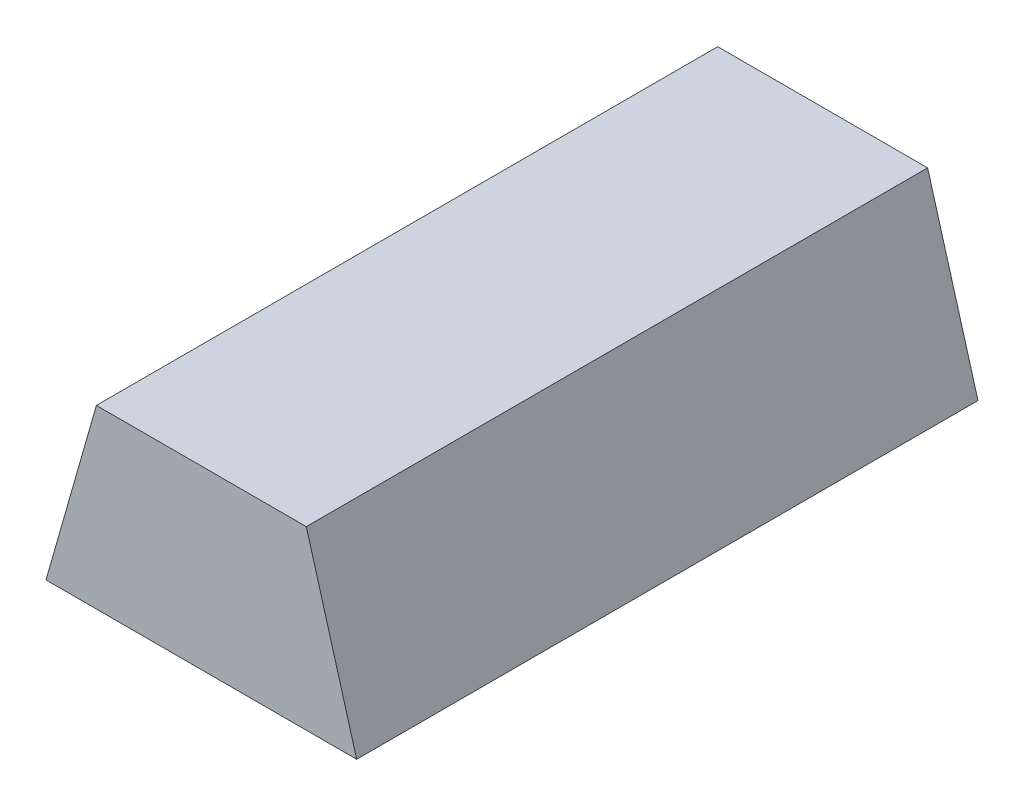
ISO-10303-21;
HEADER;
FILE_DESCRIPTION(('STEP AP214'),'2;1');
FILE_NAME('part.step','',(''),(''),'','','');
FILE_SCHEMA(('AUTOMOTIVE_DESIGN { 1 0 10303 214 1 1 1 1 }'));
ENDSEC;
DATA;
#1=APPLICATION_CONTEXT('core data for automotive mechanical design processes');
#2=APPLICATION_PROTOCOL_DEFINITION('international standard','automotive_design',2000,#1);
#3=PRODUCT_CONTEXT('',#1,'mechanical');
#4=PRODUCT('Part','Part','',(#3));
#5=PRODUCT_RELATED_PRODUCT_CATEGORY('part','',(#4));
#6=PRODUCT_DEFINITION_FORMATION('','',#4);
#7=PRODUCT_DEFINITION_CONTEXT('part definition',#1,'design');
#8=PRODUCT_DEFINITION('design','',#6,#7);
#9=PRODUCT_DEFINITION_SHAPE('','',#8);
#10=(LENGTH_UNIT() NAMED_UNIT(*) SI_UNIT(.MILLI.,.METRE.));
#11=(NAMED_UNIT(*) PLANE_ANGLE_UNIT() SI_UNIT($,.RADIAN.));
#12=(NAMED_UNIT(*) SI_UNIT($,.STERADIAN.) SOLID_ANGLE_UNIT());
#13=UNCERTAINTY_MEASURE_WITH_UNIT(LENGTH_MEASURE(1.E-05),#10,'distance_accuracy_value','');
#14=(GEOMETRIC_REPRESENTATION_CONTEXT(3) GLOBAL_UNCERTAINTY_ASSIGNED_CONTEXT((#13)) GLOBAL_UNIT_ASSIGNED_CONTEXT((#10,
#11,#12)) REPRESENTATION_CONTEXT('',''));
#15=CARTESIAN_POINT('',(0.,0.,0.));
#16=DIRECTION('',(0.,0.,1.));
#17=DIRECTION('',(1.,0.,0.));
#18=AXIS2_PLACEMENT_3D('',#15,#16,#17);
#19=CARTESIAN_POINT('',(12.5,10.5,74.));
#20=DIRECTION('',(-0.961523947640823,-0.274721127897378,0.));
#21=DIRECTION('',(0.274721127897378,-0.961523947640823,0.));
#22=AXIS2_PLACEMENT_3D('',#19,#20,#21);
#23=PLANE('',#22);
#24=DIRECTION('',(-0.274721127897378,0.961523947640823,0.));
#25=VECTOR('',#24,1.);
#26=CARTESIAN_POINT('',(12.5,10.5,0.));
#27=LINE('',#26,#25);
#28=CARTESIAN_POINT('',(18.5,-10.5,0.));
#29=VERTEX_POINT('',#28);
#30=CARTESIAN_POINT('',(12.5,10.5,0.));
#31=VERTEX_POINT('',#30);
#32=EDGE_CURVE('E107',#29,#31,#27,.T.);
#33=ORIENTED_EDGE('',*,*,#32,.T.);
#34=DIRECTION('',(0.,0.,-1.));
#35=VECTOR('',#34,1.);
#36=CARTESIAN_POINT('',(12.5,10.5,74.));
#37=LINE('',#36,#35);
#38=CARTESIAN_POINT('',(12.5,10.5,74.));
#39=VERTEX_POINT('',#38);
#40=EDGE_CURVE('E11',#39,#31,#37,.T.);
#41=ORIENTED_EDGE('',*,*,#40,.F.);
#42=DIRECTION('',(-0.274721127897378,0.961523947640823,0.));
#43=VECTOR('',#42,1.);
#44=CARTESIAN_POINT('',(12.5,10.5,74.));
#45=LINE('',#44,#43);
#46=CARTESIAN_POINT('',(18.5,-10.5,74.));
#47=VERTEX_POINT('',#46);
#48=EDGE_CURVE('E91',#47,#39,#45,.T.);
#49=ORIENTED_EDGE('',*,*,#48,.F.);
#50=DIRECTION('',(0.,0.,-1.));
#51=VECTOR('',#50,1.);
#52=CARTESIAN_POINT('',(18.5,-10.5,74.));
#53=LINE('',#52,#51);
#54=EDGE_CURVE('E103',#47,#29,#53,.T.);
#55=ORIENTED_EDGE('',*,*,#54,.T.);
#56=EDGE_LOOP('',(#33,#41,#49,#55));
#57=FACE_BOUND('',#56,.T.);
#58=ADVANCED_FACE('F39',(#57),#23,.F.);
#59=CARTESIAN_POINT('',(-12.5,10.5,74.));
#60=DIRECTION('',(0.,-1.,0.));
#61=DIRECTION('',(0.,0.,-1.));
#62=AXIS2_PLACEMENT_3D('',#59,#60,#61);
#63=PLANE('',#62);
#64=DIRECTION('',(-1.,0.,0.));
#65=VECTOR('',#64,1.);
#66=CARTESIAN_POINT('',(-12.5,10.5,0.));
#67=LINE('',#66,#65);
#68=CARTESIAN_POINT('',(-12.5,10.5,0.));
#69=VERTEX_POINT('',#68);
#70=EDGE_CURVE('E96',#31,#69,#67,.T.);
#71=ORIENTED_EDGE('',*,*,#70,.T.);
#72=DIRECTION('',(0.,0.,-1.));
#73=VECTOR('',#72,1.);
#74=CARTESIAN_POINT('',(-12.5,10.5,74.));
#75=LINE('',#74,#73);
#76=CARTESIAN_POINT('',(-12.5,10.5,74.));
#77=VERTEX_POINT('',#76);
#78=EDGE_CURVE('E48',#77,#69,#75,.T.);
#79=ORIENTED_EDGE('',*,*,#78,.F.);
#80=DIRECTION('',(-1.,0.,0.));
#81=VECTOR('',#80,1.);
#82=CARTESIAN_POINT('',(-12.5,10.5,74.));
#83=LINE('',#82,#81);
#84=EDGE_CURVE('E86',#39,#77,#83,.T.);
#85=ORIENTED_EDGE('',*,*,#84,.F.);
#86=ORIENTED_EDGE('',*,*,#40,.T.);
#87=EDGE_LOOP('',(#71,#79,#85,#86));
#88=FACE_BOUND('',#87,.T.);
#89=ADVANCED_FACE('F95',(#88),#63,.F.);
#90=CARTESIAN_POINT('',(-12.5,10.5,74.));
#91=DIRECTION('',(0.961523947640823,-0.274721127897378,0.));
#92=DIRECTION('',(0.274721127897378,0.961523947640823,0.));
#93=AXIS2_PLACEMENT_3D('',#90,#91,#92);
#94=PLANE('',#93);
#95=DIRECTION('',(-0.274721127897378,-0.961523947640823,0.));
#96=VECTOR('',#95,1.);
#97=CARTESIAN_POINT('',(-12.5,10.5,0.));
#98=LINE('',#97,#96);
#99=CARTESIAN_POINT('',(-18.5,-10.5,0.));
#100=VERTEX_POINT('',#99);
#101=EDGE_CURVE('E73',#69,#100,#98,.T.);
#102=ORIENTED_EDGE('',*,*,#101,.T.);
#103=DIRECTION('',(0.,0.,-1.));
#104=VECTOR('',#103,1.);
#105=CARTESIAN_POINT('',(-18.5,-10.5,74.));
#106=LINE('',#105,#104);
#107=CARTESIAN_POINT('',(-18.5,-10.5,74.));
#108=VERTEX_POINT('',#107);
#109=EDGE_CURVE('E98',#108,#100,#106,.T.);
#110=ORIENTED_EDGE('',*,*,#109,.F.);
#111=DIRECTION('',(-0.274721127897378,-0.961523947640823,0.));
#112=VECTOR('',#111,1.);
#113=CARTESIAN_POINT('',(-12.5,10.5,74.));
#114=LINE('',#113,#112);
#115=EDGE_CURVE('E89',#77,#108,#114,.T.);
#116=ORIENTED_EDGE('',*,*,#115,.F.);
#117=ORIENTED_EDGE('',*,*,#78,.T.);
#118=EDGE_LOOP('',(#102,#110,#116,#117));
#119=FACE_BOUND('',#118,.T.);
#120=ADVANCED_FACE('F99',(#119),#94,.F.);
#121=CARTESIAN_POINT('',(18.5,-10.5,74.));
#122=DIRECTION('',(0.,1.,0.));
#123=DIRECTION('',(0.,0.,1.));
#124=AXIS2_PLACEMENT_3D('',#121,#122,#123);
#125=PLANE('',#124);
#126=DIRECTION('',(1.,0.,0.));
#127=VECTOR('',#126,1.);
#128=CARTESIAN_POINT('',(18.5,-10.5,0.));
#129=LINE('',#128,#127);
#130=EDGE_CURVE('E79',#100,#29,#129,.T.);
#131=ORIENTED_EDGE('',*,*,#130,.T.);
#132=ORIENTED_EDGE('',*,*,#54,.F.);
#133=DIRECTION('',(1.,0.,0.));
#134=VECTOR('',#133,1.);
#135=CARTESIAN_POINT('',(18.5,-10.5,74.));
#136=LINE('',#135,#134);
#137=EDGE_CURVE('E56',#108,#47,#136,.T.);
#138=ORIENTED_EDGE('',*,*,#137,.F.);
#139=ORIENTED_EDGE('',*,*,#109,.T.);
#140=EDGE_LOOP('',(#131,#132,#138,#139));
#141=FACE_BOUND('',#140,.T.);
#142=ADVANCED_FACE('F120',(#141),#125,.F.);
#143=CARTESIAN_POINT('',(0.,0.,74.));
#144=DIRECTION('',(0.,0.,-1.));
#145=DIRECTION('',(-1.,0.,0.));
#146=AXIS2_PLACEMENT_3D('',#143,#144,#145);
#147=PLANE('',#146);
#148=ORIENTED_EDGE('',*,*,#48,.T.);
#149=ORIENTED_EDGE('',*,*,#84,.T.);
#150=ORIENTED_EDGE('',*,*,#115,.T.);
#151=ORIENTED_EDGE('',*,*,#137,.T.);
#152=EDGE_LOOP('',(#148,#149,#150,#151));
#153=FACE_BOUND('',#152,.T.);
#154=ADVANCED_FACE('F87',(#153),#147,.F.);
#155=CARTESIAN_POINT('',(0.,0.,0.));
#156=DIRECTION('',(0.,0.,-1.));
#157=DIRECTION('',(-1.,0.,0.));
#158=AXIS2_PLACEMENT_3D('',#155,#156,#157);
#159=PLANE('',#158);
#160=ORIENTED_EDGE('',*,*,#32,.F.);
#161=ORIENTED_EDGE('',*,*,#130,.F.);
#162=ORIENTED_EDGE('',*,*,#101,.F.);
#163=ORIENTED_EDGE('',*,*,#70,.F.);
#164=EDGE_LOOP('',(#160,#161,#162,#163));
#165=FACE_BOUND('',#164,.T.);
#166=ADVANCED_FACE('F123',(#165),#159,.T.);
#167=CLOSED_SHELL('',(#58,#89,#120,#142,#154,#166));
#168=MANIFOLD_SOLID_BREP('B2',#167);
#169=ADVANCED_BREP_SHAPE_REPRESENTATION('',(#18,#168),#14);
#170=SHAPE_DEFINITION_REPRESENTATION(#9,#169);
ENDSEC;
END-ISO-10303-21;
